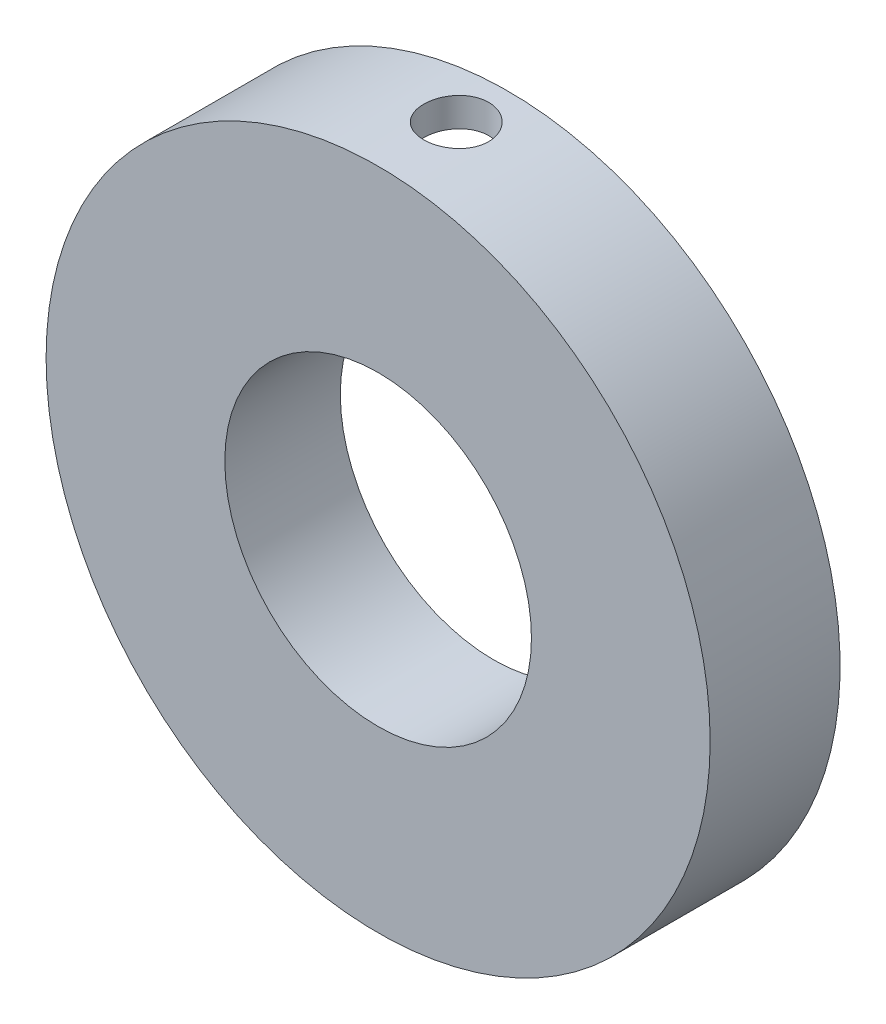
ISO-10303-21;
HEADER;
FILE_DESCRIPTION(('STEP AP214'),'2;1');
FILE_NAME('part.step','',(''),(''),'','','');
FILE_SCHEMA(('AUTOMOTIVE_DESIGN { 1 0 10303 214 1 1 1 1 }'));
ENDSEC;
DATA;
#1=APPLICATION_CONTEXT('core data for automotive mechanical design processes');
#2=APPLICATION_PROTOCOL_DEFINITION('international standard','automotive_design',2000,#1);
#3=PRODUCT_CONTEXT('',#1,'mechanical');
#4=PRODUCT('Part','Part','',(#3));
#5=PRODUCT_RELATED_PRODUCT_CATEGORY('part','',(#4));
#6=PRODUCT_DEFINITION_FORMATION('','',#4);
#7=PRODUCT_DEFINITION_CONTEXT('part definition',#1,'design');
#8=PRODUCT_DEFINITION('design','',#6,#7);
#9=PRODUCT_DEFINITION_SHAPE('','',#8);
#10=(LENGTH_UNIT() NAMED_UNIT(*) SI_UNIT(.MILLI.,.METRE.));
#11=(NAMED_UNIT(*) PLANE_ANGLE_UNIT() SI_UNIT($,.RADIAN.));
#12=(NAMED_UNIT(*) SI_UNIT($,.STERADIAN.) SOLID_ANGLE_UNIT());
#13=UNCERTAINTY_MEASURE_WITH_UNIT(LENGTH_MEASURE(1.E-05),#10,'distance_accuracy_value','');
#14=(GEOMETRIC_REPRESENTATION_CONTEXT(3) GLOBAL_UNCERTAINTY_ASSIGNED_CONTEXT((#13)) GLOBAL_UNIT_ASSIGNED_CONTEXT((#10,
#11,#12)) REPRESENTATION_CONTEXT('',''));
#15=CARTESIAN_POINT('',(0.,0.,0.));
#16=DIRECTION('',(0.,0.,1.));
#17=DIRECTION('',(1.,0.,0.));
#18=AXIS2_PLACEMENT_3D('',#15,#16,#17);
#19=CARTESIAN_POINT('',(0.,0.,0.));
#20=DIRECTION('',(0.,0.,1.));
#21=DIRECTION('',(1.,0.,0.));
#22=AXIS2_PLACEMENT_3D('',#19,#20,#21);
#23=PLANE('',#22);
#24=CARTESIAN_POINT('',(0.,0.,0.));
#25=DIRECTION('',(0.,0.,1.));
#26=DIRECTION('',(1.,0.,0.));
#27=AXIS2_PLACEMENT_3D('',#24,#25,#26);
#28=CIRCLE('',#27,13.);
#29=CARTESIAN_POINT('',(13.,0.,0.));
#30=VERTEX_POINT('',#29);
#31=EDGE_CURVE('E62',#30,#30,#28,.T.);
#32=ORIENTED_EDGE('',*,*,#31,.T.);
#33=EDGE_LOOP('',(#32));
#34=FACE_BOUND('',#33,.T.);
#35=CARTESIAN_POINT('',(0.,0.,0.));
#36=DIRECTION('',(0.,0.,-1.));
#37=DIRECTION('',(-1.,0.,0.));
#38=AXIS2_PLACEMENT_3D('',#35,#36,#37);
#39=CIRCLE('',#38,21.);
#40=CARTESIAN_POINT('',(-21.,0.,0.));
#41=VERTEX_POINT('',#40);
#42=EDGE_CURVE('E84',#41,#41,#39,.T.);
#43=ORIENTED_EDGE('',*,*,#42,.T.);
#44=EDGE_LOOP('',(#43));
#45=FACE_BOUND('',#44,.T.);
#46=ADVANCED_FACE('F41',(#34,#45),#23,.F.);
#47=CARTESIAN_POINT('',(0.,0.,3.));
#48=DIRECTION('',(0.,0.,1.));
#49=DIRECTION('',(1.,0.,0.));
#50=AXIS2_PLACEMENT_3D('',#47,#48,#49);
#51=PLANE('',#50);
#52=CARTESIAN_POINT('',(0.,0.,3.));
#53=DIRECTION('',(0.,0.,1.));
#54=DIRECTION('',(1.,0.,0.));
#55=AXIS2_PLACEMENT_3D('',#52,#53,#54);
#56=CIRCLE('',#55,23.);
#57=CARTESIAN_POINT('',(23.,0.,3.));
#58=VERTEX_POINT('',#57);
#59=EDGE_CURVE('E10',#58,#58,#56,.T.);
#60=ORIENTED_EDGE('',*,*,#59,.T.);
#61=EDGE_LOOP('',(#60));
#62=FACE_BOUND('',#61,.T.);
#63=CARTESIAN_POINT('',(0.,0.,3.));
#64=DIRECTION('',(0.,0.,1.));
#65=DIRECTION('',(1.,0.,0.));
#66=AXIS2_PLACEMENT_3D('',#63,#64,#65);
#67=CIRCLE('',#66,10.62);
#68=CARTESIAN_POINT('',(10.62,0.,3.));
#69=VERTEX_POINT('',#68);
#70=EDGE_CURVE('E56',#69,#69,#67,.T.);
#71=ORIENTED_EDGE('',*,*,#70,.F.);
#72=EDGE_LOOP('',(#71));
#73=FACE_BOUND('',#72,.T.);
#74=ADVANCED_FACE('F138',(#62,#73),#51,.T.);
#75=CARTESIAN_POINT('',(0.,0.,3.));
#76=DIRECTION('',(0.,0.,-1.));
#77=DIRECTION('',(-1.,0.,0.));
#78=AXIS2_PLACEMENT_3D('',#75,#76,#77);
#79=CYLINDRICAL_SURFACE('',#78,23.);
#80=CARTESIAN_POINT('',(0.,23.,-0.157178774055604));
#81=CARTESIAN_POINT('',(-0.126060265006668,22.9999985774956,-0.157184239967847));
#82=CARTESIAN_POINT('',(-0.252204222578188,22.9989526005092,-0.167808564674707));
#83=CARTESIAN_POINT('',(-0.500995927614825,22.9948805690746,-0.210031251051163));
#84=CARTESIAN_POINT('',(-0.623639651208335,22.9918523244948,-0.241652812322372));
#85=CARTESIAN_POINT('',(-0.861792042842789,22.9841576446636,-0.324941477859882));
#86=CARTESIAN_POINT('',(-0.977304934064706,22.979492190198,-0.376596582791336));
#87=CARTESIAN_POINT('',(-1.19799539285262,22.9690449843519,-0.498462996507294));
#88=CARTESIAN_POINT('',(-1.30317503162239,22.9632634573693,-0.56867057616936));
#89=CARTESIAN_POINT('',(-1.500601861978,22.9512095911876,-0.725909241114407));
#90=CARTESIAN_POINT('',(-1.59280839701439,22.9449358009385,-0.812991267742369));
#91=CARTESIAN_POINT('',(-1.76132225590393,22.9326165267729,-1.00139835333611));
#92=CARTESIAN_POINT('',(-1.83762884969906,22.9265710533501,-1.10272406595413));
#93=CARTESIAN_POINT('',(-1.97231993342324,22.9153779710911,-1.31699565307619));
#94=CARTESIAN_POINT('',(-2.03066776992402,22.9102322076625,-1.42996467258389));
#95=CARTESIAN_POINT('',(-2.1275510030352,22.9014389761689,-1.66415549764781));
#96=CARTESIAN_POINT('',(-2.16608686939724,22.8977914725799,-1.78537710745384));
#97=CARTESIAN_POINT('',(-2.22213207495516,22.8924207397551,-2.0322183511046));
#98=CARTESIAN_POINT('',(-2.23970869472631,22.8906913544881,-2.15782257273998));
#99=CARTESIAN_POINT('',(-2.25354443034167,22.8893335077251,-2.41020926801621));
#100=CARTESIAN_POINT('',(-2.24980408390276,22.889704993235,-2.53699171185606));
#101=CARTESIAN_POINT('',(-2.22116753708233,22.8925012970295,-2.78767255889145));
#102=CARTESIAN_POINT('',(-2.19634474991912,22.8949189899142,-2.91157943909905));
#103=CARTESIAN_POINT('',(-2.1263621541895,22.9015241584866,-3.15345993153447));
#104=CARTESIAN_POINT('',(-2.08120208154104,22.9057116571552,-3.271433466695));
#105=CARTESIAN_POINT('',(-1.97174564619206,22.9153928109077,-3.49833062837612));
#106=CARTESIAN_POINT('',(-1.90741666106157,22.9208886894131,-3.60723841893503));
#107=CARTESIAN_POINT('',(-1.7614719166452,22.932565451112,-3.81273932491188));
#108=CARTESIAN_POINT('',(-1.67985567329067,22.938746353485,-3.90933209536982));
#109=CARTESIAN_POINT('',(-1.50124292493382,22.9511284740772,-4.08788768444423));
#110=CARTESIAN_POINT('',(-1.40418300935381,22.9573296680454,-4.16978708725835));
#111=CARTESIAN_POINT('',(-1.19765842380042,22.9690290071629,-4.31613976521342));
#112=CARTESIAN_POINT('',(-1.08819374081044,22.9745271515745,-4.38059302204749));
#113=CARTESIAN_POINT('',(-0.859923366020609,22.9842025929843,-4.49022107560293));
#114=CARTESIAN_POINT('',(-0.741116146846944,22.9883796734441,-4.53539271225732));
#115=CARTESIAN_POINT('',(-0.497553664282933,22.9949400968995,-4.60512908366696));
#116=CARTESIAN_POINT('',(-0.372798571204624,22.9973234912228,-4.62969440809141));
#117=CARTESIAN_POINT('',(-0.1214309332261,23.0000214048787,-4.65744051720058));
#118=CARTESIAN_POINT('',(0.00517186397226487,23.0003443914333,-4.66070882292959));
#119=CARTESIAN_POINT('',(0.257123439031655,22.9989077891628,-4.64599790729454));
#120=CARTESIAN_POINT('',(0.382472233072552,22.9971482272428,-4.62801896043228));
#121=CARTESIAN_POINT('',(0.628105428865998,22.9917497027009,-4.57139649475703));
#122=CARTESIAN_POINT('',(0.748399352385301,22.9881144622805,-4.5327938973173));
#123=CARTESIAN_POINT('',(0.980803935847654,22.9793724822101,-4.43606193434179));
#124=CARTESIAN_POINT('',(1.09291441974974,22.9742657109164,-4.37793214889058));
#125=CARTESIAN_POINT('',(1.306165792616,22.9631309758652,-4.24357844296594));
#126=CARTESIAN_POINT('',(1.40727025690397,22.9571001033627,-4.16729695276868));
#127=CARTESIAN_POINT('',(1.59527104165881,22.9448034057546,-3.99888782097026));
#128=CARTESIAN_POINT('',(1.6821670209899,22.9385375750121,-3.90675979901392));
#129=CARTESIAN_POINT('',(1.83958754636562,22.9264517411101,-3.70889119162457));
#130=CARTESIAN_POINT('',(1.9100546980304,22.9206333471383,-3.60310483219541));
#131=CARTESIAN_POINT('',(2.03222285268566,22.9101254042825,-3.38114849985036));
#132=CARTESIAN_POINT('',(2.08392410272621,22.905435840538,-3.26497866365637));
#133=CARTESIAN_POINT('',(2.16699652478956,22.8977264278218,-3.02575074340087));
#134=CARTESIAN_POINT('',(2.198401984724,22.8947037640467,-2.90270466035705));
#135=CARTESIAN_POINT('',(2.24010264688135,22.8906615469848,-2.65305469195436));
#136=CARTESIAN_POINT('',(2.25039842620423,22.8896419389381,-2.52645090395254));
#137=CARTESIAN_POINT('',(2.24957964985034,22.889722378661,-2.27384979004493));
#138=CARTESIAN_POINT('',(2.23855525563678,22.8908135003137,-2.14785215933266));
#139=CARTESIAN_POINT('',(2.19559797102151,22.8949734339172,-1.89950789040112));
#140=CARTESIAN_POINT('',(2.16366505578311,22.8980422482172,-1.77716125651895));
#141=CARTESIAN_POINT('',(2.07982178613604,22.9058093302869,-1.53959173012211));
#142=CARTESIAN_POINT('',(2.02791393835248,22.9105073935973,-1.42436794587628));
#143=CARTESIAN_POINT('',(1.90560366692751,22.9210040289373,-1.20425419991661));
#144=CARTESIAN_POINT('',(1.83520137294023,22.926802593252,-1.09936416576576));
#145=CARTESIAN_POINT('',(1.6775619518501,22.9388762285459,-0.902433322727968));
#146=CARTESIAN_POINT('',(1.59025767855257,22.9451531374324,-0.810446374651911));
#147=CARTESIAN_POINT('',(1.40142427050218,22.9574594146521,-0.64238784086962));
#148=CARTESIAN_POINT('',(1.2998917287782,22.9634887232488,-0.566320077935539));
#149=CARTESIAN_POINT('',(1.08521638584361,22.9746355234892,-0.432115641194002));
#150=CARTESIAN_POINT('',(0.972046038049855,22.9797507694705,-0.374022879133588));
#151=CARTESIAN_POINT('',(0.737579992288742,22.9884684582571,-0.277741859704614));
#152=CARTESIAN_POINT('',(0.616293657009726,22.9920726105422,-0.239531098234071));
#153=CARTESIAN_POINT('',(0.411930483607253,22.9964536455502,-0.193655363224749));
#154=CARTESIAN_POINT('',(0.330161184948867,22.9977773478126,-0.179995260111019));
#155=CARTESIAN_POINT('',(0.165606630088831,22.9995509906229,-0.161755187709198));
#156=CARTESIAN_POINT('',(0.0828213778560516,23.000000934583,-0.157175182960638));
#157=CARTESIAN_POINT('',(0.,23.,-0.157178774055604));
#158=B_SPLINE_CURVE_WITH_KNOTS('',3,(#80,#81,#82,#83,#84,#85,#86,#87,#88,#89,#90,#91,#92,#93,
#94,#95,#96,#97,#98,#99,#100,#101,#102,#103,#104,#105,#106,#107,#108,#109,#110,#111,#112,#113,
#114,#115,#116,#117,#118,#119,#120,#121,#122,#123,#124,#125,#126,#127,#128,#129,#130,#131,#132,
#133,#134,#135,#136,#137,#138,#139,#140,#141,#142,#143,#144,#145,#146,#147,#148,#149,#150,#151,
#152,#153,#154,#155,#156,#157),.UNSPECIFIED.,.T.,.F.,(4,2,2,2,2,2,2,2,2,2,2,2,2,2,2,2,2,2,2,2,2,
2,2,2,2,2,2,2,2,2,2,2,2,2,2,2,2,2,4),(0.,0.377878368551232,0.756174946770243,1.1342452887145,
1.51223969471995,1.89139350318769,2.27056471695963,2.65050475620642,3.03043578647097,
3.40914390118699,3.78784246309703,4.16522770319295,4.54261784382188,4.92065394640491,
5.29870063595442,5.67834163596463,6.05798303434413,6.4376866283297,6.8173793563655,
7.19551073088918,7.57363722023498,7.95101620378195,8.32840330305996,8.70700365761351,
9.08561310076192,9.46552603929597,9.84543397615568,10.2246984031951,10.6039524617022,
10.9816061890104,11.3592603649249,11.7368671650146,12.1144713179865,12.4936075513733,
12.8728347248774,13.2529811415243,13.6326963356625,13.8809627451151,14.1292281850121),.UNSPECIFIED.);
#159=CARTESIAN_POINT('',(0.,23.,-0.157178774055604));
#160=VERTEX_POINT('',#159);
#161=EDGE_CURVE('E160',#160,#160,#158,.T.);
#162=ORIENTED_EDGE('',*,*,#161,.T.);
#163=EDGE_LOOP('',(#162));
#164=FACE_BOUND('',#163,.T.);
#165=ORIENTED_EDGE('',*,*,#59,.F.);
#166=EDGE_LOOP('',(#165));
#167=FACE_BOUND('',#166,.T.);
#168=CARTESIAN_POINT('',(0.,0.,-6.));
#169=DIRECTION('',(0.,0.,-1.));
#170=DIRECTION('',(-1.,0.,0.));
#171=AXIS2_PLACEMENT_3D('',#168,#169,#170);
#172=CIRCLE('',#171,23.);
#173=CARTESIAN_POINT('',(-23.,0.,-6.));
#174=VERTEX_POINT('',#173);
#175=EDGE_CURVE('E77',#174,#174,#172,.T.);
#176=ORIENTED_EDGE('',*,*,#175,.F.);
#177=EDGE_LOOP('',(#176));
#178=FACE_BOUND('',#177,.T.);
#179=ADVANCED_FACE('F43',(#164,#167,#178),#79,.T.);
#180=CARTESIAN_POINT('',(0.,0.,3.));
#181=DIRECTION('',(0.,0.,-1.));
#182=DIRECTION('',(-1.,0.,0.));
#183=AXIS2_PLACEMENT_3D('',#180,#181,#182);
#184=CYLINDRICAL_SURFACE('',#183,10.62);
#185=CARTESIAN_POINT('',(0.,10.62,-1.1571787740556));
#186=CARTESIAN_POINT('',(-0.0699535269364902,10.619999071634,-1.1571817653136));
#187=CARTESIAN_POINT('',(-0.139951566631892,10.6193015145415,-1.16307075964436));
#188=CARTESIAN_POINT('',(-0.27800210057293,10.6165859112379,-1.18647143063478));
#189=CARTESIAN_POINT('',(-0.346052447902711,10.6145664623205,-1.20399545391841));
#190=CARTESIAN_POINT('',(-0.478188872240257,10.6094347214048,-1.25014467824575));
#191=CARTESIAN_POINT('',(-0.542277500363189,10.6063231414813,-1.27876264724916));
#192=CARTESIAN_POINT('',(-0.664729447968508,10.5993537924165,-1.34627212281773));
#193=CARTESIAN_POINT('',(-0.723093795908349,10.5954961576872,-1.38516177925789));
#194=CARTESIAN_POINT('',(-0.832739563945374,10.5874446829682,-1.47231492239357));
#195=CARTESIAN_POINT('',(-0.883988870293336,10.5832494455671,-1.52061868570433));
#196=CARTESIAN_POINT('',(-0.977673361103609,10.5750069509697,-1.62514252529691));
#197=CARTESIAN_POINT('',(-1.02010810991835,10.5709597010955,-1.6813629926208));
#198=CARTESIAN_POINT('',(-1.09507687944396,10.5634575490978,-1.80033086863737));
#199=CARTESIAN_POINT('',(-1.12758110643119,10.5600044428124,-1.86309717512191));
#200=CARTESIAN_POINT('',(-1.18157590350869,10.554099703694,-1.9932447658753));
#201=CARTESIAN_POINT('',(-1.20306684504588,10.5516480370857,-2.06062589441237));
#202=CARTESIAN_POINT('',(-1.23432810507952,10.5480369330349,-2.1977586647573));
#203=CARTESIAN_POINT('',(-1.24415239068228,10.5468715473522,-2.26749784470472));
#204=CARTESIAN_POINT('',(-1.25196840352065,10.5459466851912,-2.40764411242851));
#205=CARTESIAN_POINT('',(-1.24996055453343,10.5461871583611,-2.47805117619393));
#206=CARTESIAN_POINT('',(-1.23421364880559,10.5480414017742,-2.61715980265436));
#207=CARTESIAN_POINT('',(-1.22053387331138,10.5496482322046,-2.68586818151092));
#208=CARTESIAN_POINT('',(-1.1819238470221,10.5540433147604,-2.82000719140306));
#209=CARTESIAN_POINT('',(-1.15699339199217,10.5568315883326,-2.88543776291227));
#210=CARTESIAN_POINT('',(-1.0965254342323,10.5632832996716,-3.01134896535758));
#211=CARTESIAN_POINT('',(-1.06096200102327,10.5669488724837,-3.07181702950861));
#212=CARTESIAN_POINT('',(-0.980256176780396,10.5747404723666,-3.18594910616121));
#213=CARTESIAN_POINT('',(-0.935113397111844,10.5788665181157,-3.23961284246961));
#214=CARTESIAN_POINT('',(-0.836200972792314,10.5871450434254,-3.33895715968286));
#215=CARTESIAN_POINT('',(-0.782380199161476,10.5912975301527,-3.38458684873412));
#216=CARTESIAN_POINT('',(-0.667816072628442,10.5991373586214,-3.46617212672069));
#217=CARTESIAN_POINT('',(-0.607072706687539,10.6028246994867,-3.50212769743436));
#218=CARTESIAN_POINT('',(-0.480349683350175,10.6093207022233,-3.56334347417013));
#219=CARTESIAN_POINT('',(-0.414368565152792,10.6121291178768,-3.58860068390377));
#220=CARTESIAN_POINT('',(-0.279061457681948,10.6165485329897,-3.62766335769773));
#221=CARTESIAN_POINT('',(-0.209735607286334,10.6181595821199,-3.64146929679816));
#222=CARTESIAN_POINT('',(-0.0701471917650702,10.619996312428,-3.65717200959269));
#223=CARTESIAN_POINT('',(0.000107379629023412,10.6202301530993,-3.65913892700994));
#224=CARTESIAN_POINT('',(0.139945143735792,10.6193081020208,-3.65129259650841));
#225=CARTESIAN_POINT('',(0.209528349067395,10.6181522364432,-3.64147957044075));
#226=CARTESIAN_POINT('',(0.34584261826306,10.6145857667025,-3.61041015753907));
#227=CARTESIAN_POINT('',(0.412581365596889,10.6121788096907,-3.58918702702251));
#228=CARTESIAN_POINT('',(0.541552142525263,10.6063797947464,-3.53593430146566));
#229=CARTESIAN_POINT('',(0.60378403499773,10.6029877068568,-3.50390437779389));
#230=CARTESIAN_POINT('',(0.722289058231868,10.5955766377221,-3.42977623543091));
#231=CARTESIAN_POINT('',(0.778533487610233,10.5915548468925,-3.38763241886691));
#232=CARTESIAN_POINT('',(0.883175467523385,10.5833435791059,-3.29453757926475));
#233=CARTESIAN_POINT('',(0.931572742918326,10.5791540962755,-3.24358624754356));
#234=CARTESIAN_POINT('',(1.01939379777308,10.5710546417632,-3.13401462071403));
#235=CARTESIAN_POINT('',(1.05877122305406,10.5671461817819,-3.07535704512993));
#236=CARTESIAN_POINT('',(1.12711506210583,10.5600756221772,-2.95221983531988));
#237=CARTESIAN_POINT('',(1.15608166433448,10.5569135090437,-2.88774030651002));
#238=CARTESIAN_POINT('',(1.20270574719266,10.5517037344403,-2.75494204250972));
#239=CARTESIAN_POINT('',(1.22038981578973,10.5496534545936,-2.6866327491419));
#240=CARTESIAN_POINT('',(1.24403268316208,10.5468918018326,-2.54798870022249));
#241=CARTESIAN_POINT('',(1.2499919608747,10.5461803742286,-2.47765402752322));
#242=CARTESIAN_POINT('',(1.25000797397803,10.5461784395811,-2.33741676436048));
#243=CARTESIAN_POINT('',(1.2441375274716,10.5468792395432,-2.26751417108452));
#244=CARTESIAN_POINT('',(1.22081445514412,10.5496041577302,-2.12969625262149));
#245=CARTESIAN_POINT('',(1.20336182392763,10.5516282765716,-2.06178092836017));
#246=CARTESIAN_POINT('',(1.15739175072841,10.5567691652515,-1.92987220140799));
#247=CARTESIAN_POINT('',(1.12887739499459,10.5598856302994,-1.86587771055632));
#248=CARTESIAN_POINT('',(1.06160050898043,10.5668606066259,-1.74357048320409));
#249=CARTESIAN_POINT('',(1.02283790812884,10.5707191230143,-1.68525778583319));
#250=CARTESIAN_POINT('',(0.935893474112069,10.5787719199251,-1.57559677112185));
#251=CARTESIAN_POINT('',(0.887657332813715,10.5829680498606,-1.52429164521419));
#252=CARTESIAN_POINT('',(0.783247186227852,10.5912067412748,-1.43047506396943));
#253=CARTESIAN_POINT('',(0.72707130346042,10.5952492661434,-1.38796569440583));
#254=CARTESIAN_POINT('',(0.608160446946828,10.6027401714176,-1.31282703548021));
#255=CARTESIAN_POINT('',(0.545403896723471,10.6061864925505,-1.28023170628503));
#256=CARTESIAN_POINT('',(0.415304026426044,10.6120754609154,-1.22608764803482));
#257=CARTESIAN_POINT('',(0.347965842448168,10.6145192111205,-1.20452677298404));
#258=CARTESIAN_POINT('',(0.233557134684378,10.6175307029079,-1.17829280735928));
#259=CARTESIAN_POINT('',(0.187211399559824,10.6184522394049,-1.17038624547509));
#260=CARTESIAN_POINT('',(0.093917129405388,10.6196871977088,-1.1598282410951));
#261=CARTESIAN_POINT('',(0.0469685981571144,10.6200006233288,-1.15717676564801));
#262=CARTESIAN_POINT('',(0.,10.62,-1.1571787740556));
#263=B_SPLINE_CURVE_WITH_KNOTS('',3,(#185,#186,#187,#188,#189,#190,#191,#192,#193,#194,#195,
#196,#197,#198,#199,#200,#201,#202,#203,#204,#205,#206,#207,#208,#209,#210,#211,#212,#213,#214,
#215,#216,#217,#218,#219,#220,#221,#222,#223,#224,#225,#226,#227,#228,#229,#230,#231,#232,#233,
#234,#235,#236,#237,#238,#239,#240,#241,#242,#243,#244,#245,#246,#247,#248,#249,#250,#251,#252,
#253,#254,#255,#256,#257,#258,#259,#260,#261,#262),.UNSPECIFIED.,.T.,.F.,(4,2,2,2,2,2,2,2,2,2,2,
2,2,2,2,2,2,2,2,2,2,2,2,2,2,2,2,2,2,2,2,2,2,2,2,2,2,2,4),(0.,0.209689035370084,
0.419600940691925,0.629376235880383,0.839113772311377,1.04976915379128,1.26043494415216,
1.47172670755841,1.68301134422283,1.89331477462439,2.10361067288964,2.31284480159555,
2.52208272870499,2.73183514184789,2.94159606628732,3.15264133450768,3.36368700023845,
3.57479173447949,3.78588771089468,3.995731746963,4.20557183111038,4.41480359717511,
4.62404172649153,4.83424152632171,5.04444869466285,5.25571304951417,5.4669735798423,
5.67773440504756,5.88848662086037,6.09794551012345,6.30740449696086,6.51680508619622,
6.72620711743956,6.93684658322443,7.1475359417022,7.35893908484165,7.57010902620569,
7.71090052347095,7.85169113791977),.UNSPECIFIED.);
#264=CARTESIAN_POINT('',(0.,10.62,-1.1571787740556));
#265=VERTEX_POINT('',#264);
#266=EDGE_CURVE('E88',#265,#265,#263,.T.);
#267=ORIENTED_EDGE('',*,*,#266,.F.);
#268=EDGE_LOOP('',(#267));
#269=FACE_BOUND('',#268,.T.);
#270=ORIENTED_EDGE('',*,*,#70,.T.);
#271=EDGE_LOOP('',(#270));
#272=FACE_BOUND('',#271,.T.);
#273=CARTESIAN_POINT('',(0.,0.,-5.));
#274=DIRECTION('',(0.,0.,1.));
#275=DIRECTION('',(1.,0.,0.));
#276=AXIS2_PLACEMENT_3D('',#273,#274,#275);
#277=CIRCLE('',#276,10.62);
#278=CARTESIAN_POINT('',(10.62,0.,-5.));
#279=VERTEX_POINT('',#278);
#280=EDGE_CURVE('E72',#279,#279,#277,.T.);
#281=ORIENTED_EDGE('',*,*,#280,.F.);
#282=EDGE_LOOP('',(#281));
#283=FACE_BOUND('',#282,.T.);
#284=ADVANCED_FACE('F106',(#269,#272,#283),#184,.F.);
#285=CARTESIAN_POINT('',(0.,0.,-5.));
#286=DIRECTION('',(0.,0.,1.));
#287=DIRECTION('',(1.,0.,0.));
#288=AXIS2_PLACEMENT_3D('',#285,#286,#287);
#289=CYLINDRICAL_SURFACE('',#288,13.);
#290=CARTESIAN_POINT('',(0.,13.,-1.1571787740556));
#291=CARTESIAN_POINT('',(0.070039545427337,12.9999992218953,-1.15718181382796));
#292=CARTESIAN_POINT('',(0.140125736712685,12.9994279570574,-1.16308523428127));
#293=CARTESIAN_POINT('',(0.278356023972752,12.9972039987612,-1.1865465616716));
#294=CARTESIAN_POINT('',(0.346497877764225,12.9955501055673,-1.20411739839358));
#295=CARTESIAN_POINT('',(0.478817693387374,12.9913476355749,-1.25039816093246));
#296=CARTESIAN_POINT('',(0.542997985775766,12.9887995908131,-1.27910146379346));
#297=CARTESIAN_POINT('',(0.665615463885838,12.9830939390627,-1.34681976376666));
#298=CARTESIAN_POINT('',(0.724053809626487,12.9799364555798,-1.38583267217663));
#299=CARTESIAN_POINT('',(0.833738059973964,12.9733539822169,-1.4732027714127));
#300=CARTESIAN_POINT('',(0.884962104887812,12.9699282262667,-1.52158734967523));
#301=CARTESIAN_POINT('',(0.97857588186282,12.9632016692502,-1.626269021731));
#302=CARTESIAN_POINT('',(1.02096521049874,12.9599008738958,-1.68256647665846));
#303=CARTESIAN_POINT('',(1.09578294342739,12.9537900496162,-1.80161165843795));
#304=CARTESIAN_POINT('',(1.12819169304498,12.9509809937028,-1.86437179212405));
#305=CARTESIAN_POINT('',(1.18200279216686,12.9461810408994,-1.99447466734949));
#306=CARTESIAN_POINT('',(1.20340539436805,12.9441901252254,-2.06181730363613));
#307=CARTESIAN_POINT('',(1.23453215970632,12.9412586919906,-2.19895147066826));
#308=CARTESIAN_POINT('',(1.24429244088808,12.9403149264888,-2.26873473273865));
#309=CARTESIAN_POINT('',(1.25196913662804,12.9395745274106,-2.40895483584762));
#310=CARTESIAN_POINT('',(1.24988584047395,12.9397778658154,-2.47939166088051));
#311=CARTESIAN_POINT('',(1.23396430730974,12.9413057369858,-2.61867083454582));
#312=CARTESIAN_POINT('',(1.22016546086922,12.9426265125999,-2.6875177330654));
#313=CARTESIAN_POINT('',(1.18126579353027,12.9462345658184,-2.82191386174727));
#314=CARTESIAN_POINT('',(1.15616483034252,12.9485218555909,-2.88746305038111));
#315=CARTESIAN_POINT('',(1.09532982030078,12.9538095418947,-3.01352776239028));
#316=CARTESIAN_POINT('',(1.05957824873781,12.9568111120658,-3.07403477764498));
#317=CARTESIAN_POINT('',(0.978469480219147,12.9631881444639,-3.18820448335186));
#318=CARTESIAN_POINT('',(0.933112023463791,12.9665636168023,-3.24186698862532));
#319=CARTESIAN_POINT('',(0.833858782138977,12.9733248595388,-3.34105332402345));
#320=CARTESIAN_POINT('',(0.779928970285431,12.9767106158774,-3.38654311181894));
#321=CARTESIAN_POINT('',(0.665180181203469,12.9830979262229,-3.46782902944675));
#322=CARTESIAN_POINT('',(0.604361197107262,12.9860994798466,-3.50362514961538));
#323=CARTESIAN_POINT('',(0.477537264932486,12.9913810699768,-3.56450606013512));
#324=CARTESIAN_POINT('',(0.411531508737654,12.9936609937716,-3.58958917743164));
#325=CARTESIAN_POINT('',(0.276218575923909,12.9972412572444,-3.62830739076338));
#326=CARTESIAN_POINT('',(0.206911490621654,12.9985416240008,-3.64194280325458));
#327=CARTESIAN_POINT('',(0.0672581464717231,13.0000127799493,-3.65733548556162));
#328=CARTESIAN_POINT('',(-0.0030828883338883,13.0001880374211,-3.65913974245958));
#329=CARTESIAN_POINT('',(-0.143066366037193,12.9994011977085,-3.65094222862971));
#330=CARTESIAN_POINT('',(-0.21270881763829,12.9984391147117,-3.64094060517189));
#331=CARTESIAN_POINT('',(-0.349183022505995,12.9954885909243,-3.60945421215595));
#332=CARTESIAN_POINT('',(-0.416019884968309,12.9935021118921,-3.58799138846234));
#333=CARTESIAN_POINT('',(-0.545144337270877,12.9887257244406,-3.53421436477379));
#334=CARTESIAN_POINT('',(-0.607431832404089,12.9859357993015,-3.50189993895255));
#335=CARTESIAN_POINT('',(-0.725902223119138,12.9798536237485,-3.42722008842));
#336=CARTESIAN_POINT('',(-0.782065538511857,12.9765598386527,-3.3848237291307));
#337=CARTESIAN_POINT('',(-0.886495235001598,12.9698446318738,-3.29122792519185));
#338=CARTESIAN_POINT('',(-0.934761433012657,12.9664232072337,-3.24002827650416));
#339=CARTESIAN_POINT('',(-1.0221894543887,12.9598249456202,-3.13007451977257));
#340=CARTESIAN_POINT('',(-1.06132048313187,12.9566489594136,-3.07129586764296));
#341=CARTESIAN_POINT('',(-1.129155819334,12.9509139050058,-2.94797394629524));
#342=CARTESIAN_POINT('',(-1.15786026002456,12.9483548289218,-2.88343075074995));
#343=CARTESIAN_POINT('',(-1.20397582971432,12.9441485315908,-2.75051834130861));
#344=CARTESIAN_POINT('',(-1.22140541160731,12.9424998210535,-2.68215557894675));
#345=CARTESIAN_POINT('',(-1.24453642670967,12.9402962191554,-2.54345718196205));
#346=CARTESIAN_POINT('',(-1.25023816868133,12.9397412989981,-2.47312159932765));
#347=CARTESIAN_POINT('',(-1.24974754744341,12.9397886701037,-2.33278019297332));
#348=CARTESIAN_POINT('',(-1.24360356059377,12.9403862546954,-2.26277419350478));
#349=CARTESIAN_POINT('',(-1.21969718108888,12.9426612757535,-2.12479364523408));
#350=CARTESIAN_POINT('',(-1.20193477409703,12.9443387135522,-2.05681909893877));
#351=CARTESIAN_POINT('',(-1.15530885095639,12.9485831473165,-1.92483052188747));
#352=CARTESIAN_POINT('',(-1.12644662367959,12.9511500399983,-1.86081603230513));
#353=CARTESIAN_POINT('',(-1.05844542466451,12.9568843652751,-1.73853257053816));
#354=CARTESIAN_POINT('',(-1.01930653592749,12.9600517930197,-1.68026355195447));
#355=CARTESIAN_POINT('',(-0.931681227071521,12.9666457740777,-1.5708771766045));
#356=CARTESIAN_POINT('',(-0.883158794758857,12.9700732937474,-1.51978872558046));
#357=CARTESIAN_POINT('',(-0.778213948519765,12.9767924245843,-1.42645731412416));
#358=CARTESIAN_POINT('',(-0.721789640521863,12.9800840029209,-1.38421648053294));
#359=CARTESIAN_POINT('',(-0.602499056073222,12.9861683153416,-1.30970255532026));
#360=CARTESIAN_POINT('',(-0.539617932106111,12.9889598572575,-1.27745315489931));
#361=CARTESIAN_POINT('',(-0.409347100447144,12.9937163984295,-1.22401326188142));
#362=CARTESIAN_POINT('',(-0.341962598959869,12.9956823336186,-1.20281024017588));
#363=CARTESIAN_POINT('',(-0.228493822820208,12.9980695257425,-1.17737995990928));
#364=CARTESIAN_POINT('',(-0.18313602306632,12.9987900976756,-1.16981479585155));
#365=CARTESIAN_POINT('',(-0.0918588367138324,12.9997555890965,-1.15971321543129));
#366=CARTESIAN_POINT('',(-0.0459394522178495,13.0000005103646,-1.15717678024659));
#367=CARTESIAN_POINT('',(0.,13.,-1.1571787740556));
#368=B_SPLINE_CURVE_WITH_KNOTS('',3,(#290,#291,#292,#293,#294,#295,#296,#297,#298,#299,#300,
#301,#302,#303,#304,#305,#306,#307,#308,#309,#310,#311,#312,#313,#314,#315,#316,#317,#318,#319,
#320,#321,#322,#323,#324,#325,#326,#327,#328,#329,#330,#331,#332,#333,#334,#335,#336,#337,#338,
#339,#340,#341,#342,#343,#344,#345,#346,#347,#348,#349,#350,#351,#352,#353,#354,#355,#356,#357,
#358,#359,#360,#361,#362,#363,#364,#365,#366,#367),.UNSPECIFIED.,.T.,.F.,(4,2,2,2,2,2,2,2,2,2,2,
2,2,2,2,2,2,2,2,2,2,2,2,2,2,2,2,2,2,2,2,2,2,2,2,2,2,2,4),(0.,0.209950888686027,
0.420134833292943,0.630193926049844,0.840210493904345,1.05085032805815,1.26149977868551,
1.47256144535674,1.6836182659171,1.89401860640036,2.10441380772929,2.31410439719438,
2.52379762665738,2.73383781310021,2.9438836809911,3.15478514604695,3.36568682135153,
3.57662142123522,3.78755018993115,3.99764075130662,4.20772869197863,4.41741579194926,
4.62710725586476,4.83745061583784,5.04779885169917,5.25884624913014,5.46989094968926,
5.68058936609175,5.89128223530401,6.10111648550734,6.31095099463713,6.52076114587645,
6.73056960259936,6.94119984230932,7.15188065656229,7.363057269762,7.57399383625435,
7.71170268146246,7.84941101123586),.UNSPECIFIED.);
#369=CARTESIAN_POINT('',(0.,13.,-1.1571787740556));
#370=VERTEX_POINT('',#369);
#371=EDGE_CURVE('E100',#370,#370,#368,.T.);
#372=ORIENTED_EDGE('',*,*,#371,.F.);
#373=EDGE_LOOP('',(#372));
#374=FACE_BOUND('',#373,.T.);
#375=CARTESIAN_POINT('',(0.,0.,-5.));
#376=DIRECTION('',(0.,0.,1.));
#377=DIRECTION('',(1.,0.,0.));
#378=AXIS2_PLACEMENT_3D('',#375,#376,#377);
#379=CIRCLE('',#378,13.);
#380=CARTESIAN_POINT('',(13.,0.,-5.));
#381=VERTEX_POINT('',#380);
#382=EDGE_CURVE('E67',#381,#381,#379,.T.);
#383=ORIENTED_EDGE('',*,*,#382,.T.);
#384=EDGE_LOOP('',(#383));
#385=FACE_BOUND('',#384,.T.);
#386=ORIENTED_EDGE('',*,*,#31,.F.);
#387=EDGE_LOOP('',(#386));
#388=FACE_BOUND('',#387,.T.);
#389=ADVANCED_FACE('F127',(#374,#385,#388),#289,.T.);
#390=CARTESIAN_POINT('',(0.,0.,-5.));
#391=DIRECTION('',(0.,0.,1.));
#392=DIRECTION('',(1.,0.,0.));
#393=AXIS2_PLACEMENT_3D('',#390,#391,#392);
#394=PLANE('',#393);
#395=ORIENTED_EDGE('',*,*,#280,.T.);
#396=EDGE_LOOP('',(#395));
#397=FACE_BOUND('',#396,.T.);
#398=ORIENTED_EDGE('',*,*,#382,.F.);
#399=EDGE_LOOP('',(#398));
#400=FACE_BOUND('',#399,.T.);
#401=ADVANCED_FACE('F124',(#397,#400),#394,.F.);
#402=CARTESIAN_POINT('',(0.,0.,-6.));
#403=DIRECTION('',(0.,0.,-1.));
#404=DIRECTION('',(-1.,0.,0.));
#405=AXIS2_PLACEMENT_3D('',#402,#403,#404);
#406=PLANE('',#405);
#407=ORIENTED_EDGE('',*,*,#175,.T.);
#408=EDGE_LOOP('',(#407));
#409=FACE_BOUND('',#408,.T.);
#410=CARTESIAN_POINT('',(0.,0.,-6.));
#411=DIRECTION('',(0.,0.,-1.));
#412=DIRECTION('',(-1.,0.,0.));
#413=AXIS2_PLACEMENT_3D('',#410,#411,#412);
#414=CIRCLE('',#413,21.);
#415=CARTESIAN_POINT('',(-21.,0.,-6.));
#416=VERTEX_POINT('',#415);
#417=EDGE_CURVE('E83',#416,#416,#414,.T.);
#418=ORIENTED_EDGE('',*,*,#417,.F.);
#419=EDGE_LOOP('',(#418));
#420=FACE_BOUND('',#419,.T.);
#421=ADVANCED_FACE('F120',(#409,#420),#406,.T.);
#422=CARTESIAN_POINT('',(0.,0.,-6.));
#423=DIRECTION('',(0.,0.,1.));
#424=DIRECTION('',(1.,0.,0.));
#425=AXIS2_PLACEMENT_3D('',#422,#423,#424);
#426=CYLINDRICAL_SURFACE('',#425,21.);
#427=CARTESIAN_POINT('',(0.,21.,-0.157178774055604));
#428=CARTESIAN_POINT('',(-0.125996052693535,20.9999984580927,-0.157184205108507));
#429=CARTESIAN_POINT('',(-0.252074207683291,20.9988540412597,-0.167797757237872));
#430=CARTESIAN_POINT('',(-0.500731730046988,20.9943987895841,-0.209975150132383));
#431=CARTESIAN_POINT('',(-0.62330714457704,20.9910856008006,-0.241561755157349));
#432=CARTESIAN_POINT('',(-0.861322630018785,20.9826666073864,-0.324752190780779));
#433=CARTESIAN_POINT('',(-0.976767089282617,20.9775619184246,-0.376343565364148));
#434=CARTESIAN_POINT('',(-1.19733399717156,20.9661299131191,-0.498054025435522));
#435=CARTESIAN_POINT('',(-1.30245841841303,20.9598028311177,-0.568169560641194));
#436=CARTESIAN_POINT('',(-1.49985670084599,20.946605154117,-0.725246326955634));
#437=CARTESIAN_POINT('',(-1.59208222914152,20.9397326585714,-0.812268144121663));
#438=CARTESIAN_POINT('',(-1.76064911748035,20.9262343377319,-1.0005577087618));
#439=CARTESIAN_POINT('',(-1.83698972396607,20.9196085241523,-1.10182613169236));
#440=CARTESIAN_POINT('',(-1.97179354511349,20.9073345881751,-1.31604021046778));
#441=CARTESIAN_POINT('',(-2.03021257060893,20.9016888970913,-1.42901382559455));
#442=CARTESIAN_POINT('',(-2.12723276802654,20.8920384824536,-1.66323796028207));
#443=CARTESIAN_POINT('',(-2.1658344978583,20.8880337127041,-1.78448824672361));
#444=CARTESIAN_POINT('',(-2.22197998715078,20.8821360737866,-2.03132822333206));
#445=CARTESIAN_POINT('',(-2.23960435951838,20.8802351219457,-2.15689938113815));
#446=CARTESIAN_POINT('',(-2.25354410067662,20.8787353747831,-2.40923062075742));
#447=CARTESIAN_POINT('',(-2.24986010738177,20.8791365105431,-2.53599066686509));
#448=CARTESIAN_POINT('',(-2.2213540613305,20.8821882278765,-2.78654414123362));
#449=CARTESIAN_POINT('',(-2.19662023015324,20.8848294210286,-2.91034773713842));
#450=CARTESIAN_POINT('',(-2.12685398120512,20.89204900194,-3.15203655096748));
#451=CARTESIAN_POINT('',(-2.08182125283243,20.8966274193414,-3.26992167830013));
#452=CARTESIAN_POINT('',(-1.97263881893452,20.9072163450427,-3.49670470232021));
#453=CARTESIAN_POINT('',(-1.90845018470207,20.9132297645247,-3.60558371571016));
#454=CARTESIAN_POINT('',(-1.76280595687991,20.9260087366139,-3.81105712654346));
#455=CARTESIAN_POINT('',(-1.68134978282288,20.9327743145021,-3.90765111083739));
#456=CARTESIAN_POINT('',(-1.50299098105676,20.946337112451,-4.08632501493761));
#457=CARTESIAN_POINT('',(-1.40601220147542,20.9531343192003,-4.16832893736934));
#458=CARTESIAN_POINT('',(-1.1996248990531,20.9659622276878,-4.31490518271187));
#459=CARTESIAN_POINT('',(-1.09021635895288,20.9719929283617,-4.37947748141771));
#460=CARTESIAN_POINT('',(-0.862021019896221,20.9826107428765,-4.4893552752786));
#461=CARTESIAN_POINT('',(-0.743232234814837,20.9871975499642,-4.53465667707385));
#462=CARTESIAN_POINT('',(-0.499674260633299,20.994407748624,-4.6046498237604));
#463=CARTESIAN_POINT('',(-0.374905277083696,20.9970312076287,-4.62934227648321));
#464=CARTESIAN_POINT('',(-0.123586504888663,21.0000104305291,-4.65731963617463));
#465=CARTESIAN_POINT('',(0.00295148844220159,21.0003772980722,-4.66070936582574));
#466=CARTESIAN_POINT('',(0.254793748759089,20.9988318301095,-4.64626071762751));
#467=CARTESIAN_POINT('',(0.380098034895597,20.9969195300389,-4.62842266981636));
#468=CARTESIAN_POINT('',(0.625611626394111,20.9910376495761,-4.57211181993234));
#469=CARTESIAN_POINT('',(0.745832371101106,20.987072986939,-4.53368833586349));
#470=CARTESIAN_POINT('',(0.978122438026741,20.9775309051518,-4.4373481529573));
#471=CARTESIAN_POINT('',(1.0901915520238,20.971953444823,-4.37943095639386));
#472=CARTESIAN_POINT('',(1.30346954725844,20.9597813968758,-4.24548911902236));
#473=CARTESIAN_POINT('',(1.40463513109038,20.9531829905875,-4.16939588768456));
#474=CARTESIAN_POINT('',(1.5927954804201,20.9397210593691,-4.00135998738812));
#475=CARTESIAN_POINT('',(1.67978983634166,20.9328575267836,-3.90941686049454));
#476=CARTESIAN_POINT('',(1.83750434287794,20.9196052671343,-3.71183254932503));
#477=CARTESIAN_POINT('',(1.90815551322699,20.9132186269704,-3.60613614418115));
#478=CARTESIAN_POINT('',(2.03070330772697,20.9016757434114,-3.38431680363492));
#479=CARTESIAN_POINT('',(2.08260022079627,20.8965194810622,-3.26819402889023));
#480=CARTESIAN_POINT('',(2.16605185235918,20.8880345493265,-3.02905111689712));
#481=CARTESIAN_POINT('',(2.19764704529564,20.8847022455907,-2.9060452380024));
#482=CARTESIAN_POINT('',(2.23972944751096,20.8802314894398,-2.65643653854033));
#483=CARTESIAN_POINT('',(2.25021736015888,20.8790929639204,-2.52983383797435));
#484=CARTESIAN_POINT('',(2.24977690451966,20.8791403754963,-2.27731103281108));
#485=CARTESIAN_POINT('',(2.23895689323202,20.8803145518341,-2.15139072306154));
#486=CARTESIAN_POINT('',(2.19643552125527,20.8848299367768,-1.90316808228259));
#487=CARTESIAN_POINT('',(2.16473414194301,20.8881711473143,-1.78086575447998));
#488=CARTESIAN_POINT('',(2.08138090401896,20.8966407706688,-1.54335521710368));
#489=CARTESIAN_POINT('',(2.029732777078,20.9017688491779,-1.42814568526928));
#490=CARTESIAN_POINT('',(1.90796310201679,20.9132350511931,-1.20801279853187));
#491=CARTESIAN_POINT('',(1.83784156817864,20.9195731737636,-1.10308943567655));
#492=CARTESIAN_POINT('',(1.68070964421357,20.9327839563106,-0.905952132507193));
#493=CARTESIAN_POINT('',(1.59361844299748,20.9396590757395,-0.813802766573733));
#494=CARTESIAN_POINT('',(1.40518265504014,20.9531468933714,-0.645380870353658));
#495=CARTESIAN_POINT('',(1.30383467442264,20.9597595286071,-0.569112131259328));
#496=CARTESIAN_POINT('',(1.08944143459131,20.9719972854177,-0.43444108854033));
#497=CARTESIAN_POINT('',(0.976363698518768,20.977619542296,-0.376090262549273));
#498=CARTESIAN_POINT('',(0.742024575245099,20.987212661239,-0.279284020513904));
#499=CARTESIAN_POINT('',(0.620772499580616,20.9911853665909,-0.24080638542901));
#500=CARTESIAN_POINT('',(0.415707418966212,20.9960441465025,-0.194332862819556));
#501=CARTESIAN_POINT('',(0.333200974484066,20.9975205933788,-0.180419372502688));
#502=CARTESIAN_POINT('',(0.167141728545823,20.9994990292062,-0.161840549267414));
#503=CARTESIAN_POINT('',(0.0835889322272437,21.0000010229399,-0.157175170959291));
#504=CARTESIAN_POINT('',(0.,21.,-0.157178774055604));
#505=B_SPLINE_CURVE_WITH_KNOTS('',3,(#427,#428,#429,#430,#431,#432,#433,#434,#435,#436,#437,
#438,#439,#440,#441,#442,#443,#444,#445,#446,#447,#448,#449,#450,#451,#452,#453,#454,#455,#456,
#457,#458,#459,#460,#461,#462,#463,#464,#465,#466,#467,#468,#469,#470,#471,#472,#473,#474,#475,
#476,#477,#478,#479,#480,#481,#482,#483,#484,#485,#486,#487,#488,#489,#490,#491,#492,#493,#494,
#495,#496,#497,#498,#499,#500,#501,#502,#503,#504),.UNSPECIFIED.,.T.,.F.,(4,2,2,2,2,2,2,2,2,2,2,
2,2,2,2,2,2,2,2,2,2,2,2,2,2,2,2,2,2,2,2,2,2,2,2,2,2,2,4),(0.,0.377682899918034,
0.755776410391273,1.13363487714458,1.51142097720274,1.89058676861288,2.2697705429976,
2.64988189078091,3.02998253683149,3.40861774672839,3.78724162137559,4.16428642322127,
4.54133699458141,4.91915908876561,5.296993885869,5.67674255264984,6.056491746734,
6.43632156367878,6.81613833451513,7.19408469707646,7.57202518360543,7.94906423376786,
8.32611291146623,8.70460757687019,9.08311317957006,9.46318833457149,9.84325763408219,
10.2225668395167,10.6018634048205,10.9792361169642,11.3566091656698,11.7339116489683,
12.111213840569,12.49035874245,12.8695940543229,13.2499089186291,13.6297976498591,
13.8803631604201,14.130927441203),.UNSPECIFIED.);
#506=CARTESIAN_POINT('',(0.,21.,-0.157178774055604));
#507=VERTEX_POINT('',#506);
#508=EDGE_CURVE('E46',#507,#507,#505,.T.);
#509=ORIENTED_EDGE('',*,*,#508,.F.);
#510=EDGE_LOOP('',(#509));
#511=FACE_BOUND('',#510,.T.);
#512=ORIENTED_EDGE('',*,*,#417,.T.);
#513=EDGE_LOOP('',(#512));
#514=FACE_BOUND('',#513,.T.);
#515=ORIENTED_EDGE('',*,*,#42,.F.);
#516=EDGE_LOOP('',(#515));
#517=FACE_BOUND('',#516,.T.);
#518=ADVANCED_FACE('F113',(#511,#514,#517),#426,.F.);
#519=CARTESIAN_POINT('',(0.,7.91888416727603,-2.4071787740556));
#520=DIRECTION('',(0.,1.,0.));
#521=DIRECTION('',(0.,0.,1.));
#522=AXIS2_PLACEMENT_3D('',#519,#520,#521);
#523=CYLINDRICAL_SURFACE('',#522,1.25);
#524=ORIENTED_EDGE('',*,*,#266,.T.);
#525=EDGE_LOOP('',(#524));
#526=FACE_BOUND('',#525,.T.);
#527=ORIENTED_EDGE('',*,*,#371,.T.);
#528=EDGE_LOOP('',(#527));
#529=FACE_BOUND('',#528,.T.);
#530=ADVANCED_FACE('F109',(#526,#529),#523,.F.);
#531=CARTESIAN_POINT('',(0.,17.918884167276,-2.4071787740556));
#532=DIRECTION('',(0.,1.,0.));
#533=DIRECTION('',(0.,0.,1.));
#534=AXIS2_PLACEMENT_3D('',#531,#532,#533);
#535=CYLINDRICAL_SURFACE('',#534,2.25);
#536=ORIENTED_EDGE('',*,*,#508,.T.);
#537=EDGE_LOOP('',(#536));
#538=FACE_BOUND('',#537,.T.);
#539=ORIENTED_EDGE('',*,*,#161,.F.);
#540=EDGE_LOOP('',(#539));
#541=FACE_BOUND('',#540,.T.);
#542=ADVANCED_FACE('F112',(#538,#541),#535,.F.);
#543=CLOSED_SHELL('',(#46,#74,#179,#284,#389,#401,#421,#518,#530,#542));
#544=MANIFOLD_SOLID_BREP('B2',#543);
#545=ADVANCED_BREP_SHAPE_REPRESENTATION('',(#18,#544),#14);
#546=SHAPE_DEFINITION_REPRESENTATION(#9,#545);
ENDSEC;
END-ISO-10303-21;
